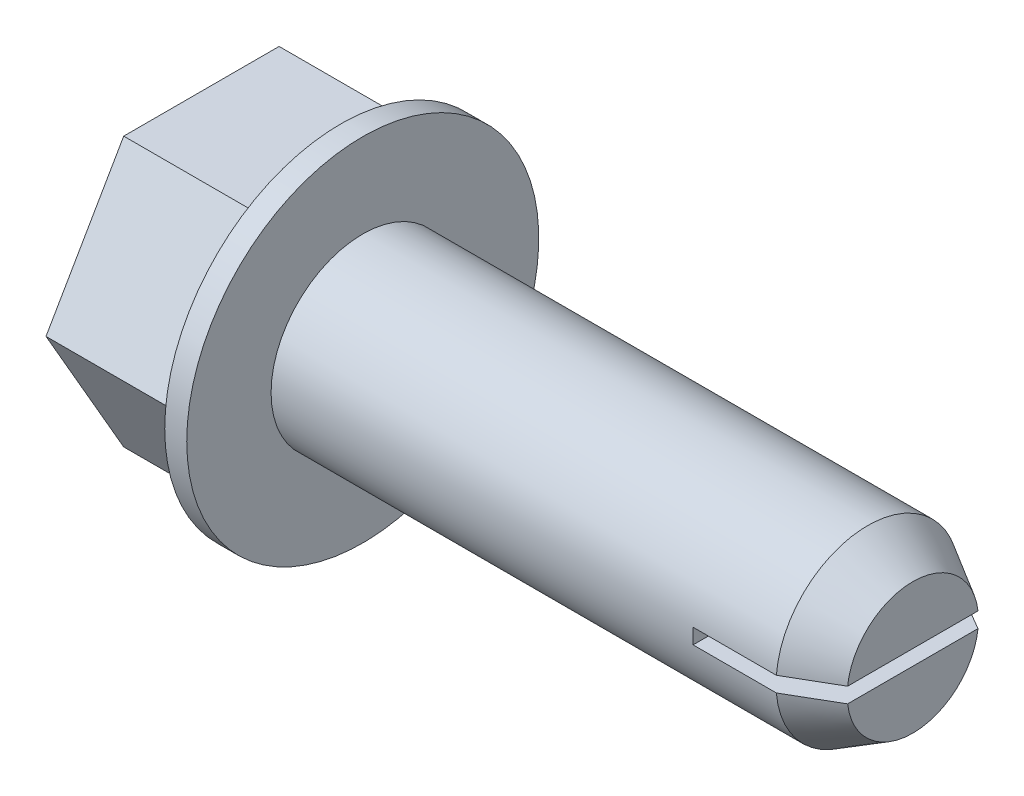
ISO-10303-21;
HEADER;
FILE_DESCRIPTION(('STEP AP214'),'2;1');
FILE_NAME('part.step','',(''),(''),'','','');
FILE_SCHEMA(('AUTOMOTIVE_DESIGN { 1 0 10303 214 1 1 1 1 }'));
ENDSEC;
DATA;
#1=APPLICATION_CONTEXT('core data for automotive mechanical design processes');
#2=APPLICATION_PROTOCOL_DEFINITION('international standard','automotive_design',2000,#1);
#3=PRODUCT_CONTEXT('',#1,'mechanical');
#4=PRODUCT('Part','Part','',(#3));
#5=PRODUCT_RELATED_PRODUCT_CATEGORY('part','',(#4));
#6=PRODUCT_DEFINITION_FORMATION('','',#4);
#7=PRODUCT_DEFINITION_CONTEXT('part definition',#1,'design');
#8=PRODUCT_DEFINITION('design','',#6,#7);
#9=PRODUCT_DEFINITION_SHAPE('','',#8);
#10=(LENGTH_UNIT() NAMED_UNIT(*) SI_UNIT(.MILLI.,.METRE.));
#11=(NAMED_UNIT(*) PLANE_ANGLE_UNIT() SI_UNIT($,.RADIAN.));
#12=(NAMED_UNIT(*) SI_UNIT($,.STERADIAN.) SOLID_ANGLE_UNIT());
#13=UNCERTAINTY_MEASURE_WITH_UNIT(LENGTH_MEASURE(1.E-05),#10,'distance_accuracy_value','');
#14=(GEOMETRIC_REPRESENTATION_CONTEXT(3) GLOBAL_UNCERTAINTY_ASSIGNED_CONTEXT((#13)) GLOBAL_UNIT_ASSIGNED_CONTEXT((#10,
#11,#12)) REPRESENTATION_CONTEXT('',''));
#15=CARTESIAN_POINT('',(0.,0.,0.));
#16=DIRECTION('',(0.,0.,1.));
#17=DIRECTION('',(1.,0.,0.));
#18=AXIS2_PLACEMENT_3D('',#15,#16,#17);
#19=CARTESIAN_POINT('',(17.4882097868151,0.,0.));
#20=DIRECTION('',(-1.,0.,0.));
#21=DIRECTION('',(0.,0.,1.));
#22=AXIS2_PLACEMENT_3D('',#19,#20,#21);
#23=CONICAL_SURFACE('',#22,3.175,0.523598775598292);
#24=CARTESIAN_POINT('',(13.5644644613219,0.264583333333333,-5.43393783266142));
#25=CARTESIAN_POINT('',(14.0871826436278,0.264583333333333,-5.13177479743097));
#26=CARTESIAN_POINT('',(14.6098866976322,0.264583333333333,-4.82958732171453));
#27=CARTESIAN_POINT('',(15.6552095136867,0.264583333333333,-4.22504701620635));
#28=CARTESIAN_POINT('',(16.1778282743568,0.264583333333333,-3.92269418402857));
#29=CARTESIAN_POINT('',(17.2241423772534,0.264583333333333,-3.31700106564912));
#30=CARTESIAN_POINT('',(17.7478373461747,0.264583333333333,-3.01366013407215));
#31=CARTESIAN_POINT('',(18.5330792932285,0.264583333333333,-2.55813812615807));
#32=CARTESIAN_POINT('',(18.794774905413,0.264583333333333,-2.4062132971754));
#33=CARTESIAN_POINT('',(19.3179928265594,0.264583333333333,-2.10206558022107));
#34=CARTESIAN_POINT('',(19.5795151356285,0.264583333333333,-1.94984269243398));
#35=CARTESIAN_POINT('',(19.9713214718428,0.264583333333333,-1.72119162168096));
#36=CARTESIAN_POINT('',(20.1017351693419,0.264583333333333,-1.64498568724022));
#37=CARTESIAN_POINT('',(20.3624339826788,0.264583333333333,-1.49234691242498));
#38=CARTESIAN_POINT('',(20.4927190953951,0.264583333333333,-1.41591406671424));
#39=CARTESIAN_POINT('',(20.7529729191661,0.264583333333333,-1.26275197273211));
#40=CARTESIAN_POINT('',(20.8829418010459,0.264583333333333,-1.18602301477345));
#41=CARTESIAN_POINT('',(21.14251237568,0.264583333333333,-1.03196432965892));
#42=CARTESIAN_POINT('',(21.2721140928904,0.264583333333333,-0.954634643864495));
#43=CARTESIAN_POINT('',(21.4659187118913,0.264583333333333,-0.837750528912931));
#44=CARTESIAN_POINT('',(21.5303977933951,0.264583333333333,-0.798654938496787));
#45=CARTESIAN_POINT('',(21.6590775625645,0.264583333333333,-0.719981892284));
#46=CARTESIAN_POINT('',(21.7232781975706,0.264583333333333,-0.680404350306108));
#47=CARTESIAN_POINT('',(21.8513452286603,0.264583333333333,-0.600412864954114));
#48=CARTESIAN_POINT('',(21.9152106571027,0.264583333333333,-0.559997359060232));
#49=CARTESIAN_POINT('',(22.0103272732384,0.264583333333333,-0.498347656476074));
#50=CARTESIAN_POINT('',(22.0419131277855,0.264583333333333,-0.477630823862634));
#51=CARTESIAN_POINT('',(22.1047544025035,0.264583333333333,-0.435703031053967));
#52=CARTESIAN_POINT('',(22.1360098430145,0.264583333333333,-0.414492101535705));
#53=CARTESIAN_POINT('',(22.1903340018692,0.264583333333333,-0.37667837356804));
#54=CARTESIAN_POINT('',(22.2135134700197,0.264583333333333,-0.360235070512369));
#55=CARTESIAN_POINT('',(22.2594652015796,0.264583333333333,-0.326749250525178));
#56=CARTESIAN_POINT('',(22.2822371615549,0.264583333333333,-0.309706312996171));
#57=CARTESIAN_POINT('',(22.327060694743,0.264583333333333,-0.274797007355579));
#58=CARTESIAN_POINT('',(22.3491137774706,0.264583333333333,-0.256932583966008));
#59=CARTESIAN_POINT('',(22.3920781971358,0.264583333333333,-0.219892857452947));
#60=CARTESIAN_POINT('',(22.4129911568137,0.264583333333333,-0.200719509836215));
#61=CARTESIAN_POINT('',(22.4452340578416,0.264583333333333,-0.167667232199067));
#62=CARTESIAN_POINT('',(22.4572435359932,0.264583333333333,-0.154459018855623));
#63=CARTESIAN_POINT('',(22.479742428192,0.264583333333333,-0.126788829304691));
#64=CARTESIAN_POINT('',(22.4902350299064,0.264583333333333,-0.112329587475477));
#65=CARTESIAN_POINT('',(22.5047631481339,0.264583333333333,-0.0879569053171079));
#66=CARTESIAN_POINT('',(22.5096896477211,0.264583333333333,-0.0785848776158666));
#67=CARTESIAN_POINT('',(22.5181377335612,0.264583333333333,-0.0592246580499537));
#68=CARTESIAN_POINT('',(22.5216621220232,0.264583333333333,-0.0492377417068181));
#69=CARTESIAN_POINT('',(22.526418522633,0.264583333333333,-0.0304037026103416));
#70=CARTESIAN_POINT('',(22.5279260208297,0.264583333333333,-0.0216280028123224));
#71=CARTESIAN_POINT('',(22.5294026767469,0.264583333333333,-0.00394842396421162));
#72=CARTESIAN_POINT('',(22.529372938949,0.264583333333333,0.00495535846215336));
#73=CARTESIAN_POINT('',(22.527783754397,0.264583333333333,0.0226015793310859));
#74=CARTESIAN_POINT('',(22.5262273778035,0.264583333333333,0.0313443057191699));
#75=CARTESIAN_POINT('',(22.521799885777,0.264583333333333,0.0484872271525425));
#76=CARTESIAN_POINT('',(22.5189273250771,0.264583333333333,0.0568870345760276));
#77=CARTESIAN_POINT('',(22.5097392618081,0.264583333333333,0.0791084101084659));
#78=CARTESIAN_POINT('',(22.5024306277301,0.264583333333333,0.0925118789448422));
#79=CARTESIAN_POINT('',(22.4859991306919,0.264583333333333,0.118165386221673));
#80=CARTESIAN_POINT('',(22.4768681425319,0.264583333333333,0.130409883182144));
#81=CARTESIAN_POINT('',(22.4502363411997,0.264583333333333,0.162907775207071));
#82=CARTESIAN_POINT('',(22.4316204301427,0.264583333333333,0.182229711479316));
#83=CARTESIAN_POINT('',(22.3928272705957,0.264583333333333,0.21926143600952));
#84=CARTESIAN_POINT('',(22.3726454888353,0.264583333333333,0.23696619389221));
#85=CARTESIAN_POINT('',(22.331293807366,0.264583333333333,0.271428766852513));
#86=CARTESIAN_POINT('',(22.3101188805033,0.264583333333333,0.288180532250144));
#87=CARTESIAN_POINT('',(22.2672661684661,0.264583333333333,0.320948333636695));
#88=CARTESIAN_POINT('',(22.2455892006051,0.264583333333333,0.336965454114015));
#89=CARTESIAN_POINT('',(22.1807081552448,0.264583333333333,0.383801752180299));
#90=CARTESIAN_POINT('',(22.1370014567618,0.264583333333333,0.413922038870454));
#91=CARTESIAN_POINT('',(22.048896754757,0.264583333333333,0.473137956582079));
#92=CARTESIAN_POINT('',(22.0044985971383,0.264583333333333,0.502233354347341));
#93=CARTESIAN_POINT('',(21.9152410723224,0.264583333333333,0.55980954616495));
#94=CARTESIAN_POINT('',(21.8703812772861,0.264583333333333,0.588289676499199));
#95=CARTESIAN_POINT('',(21.7803932808768,0.264583333333333,0.644823342437673));
#96=CARTESIAN_POINT('',(21.7352650728045,0.264583333333333,0.672876867331631));
#97=CARTESIAN_POINT('',(21.6000529942242,0.264583333333333,0.756326551992342));
#98=CARTESIAN_POINT('',(21.5097027331016,0.264583333333333,0.811290588678406));
#99=CARTESIAN_POINT('',(21.3286744912322,0.264583333333333,0.920566584265846));
#100=CARTESIAN_POINT('',(21.237996704292,0.264583333333333,0.97487886591951));
#101=CARTESIAN_POINT('',(20.9657460397315,0.264583333333333,1.13718911539779));
#102=CARTESIAN_POINT('',(20.7838413218696,0.264583333333333,1.24463004979448));
#103=CARTESIAN_POINT('',(20.4196512860542,0.264583333333333,1.45886639904696));
#104=CARTESIAN_POINT('',(20.2373659641305,0.264583333333333,1.5656618071235));
#105=CARTESIAN_POINT('',(19.872544735206,0.264583333333333,1.77891302602804));
#106=CARTESIAN_POINT('',(19.6900087832199,0.264583333333333,1.88536875994202));
#107=CARTESIAN_POINT('',(19.3248125987412,0.264583333333333,2.09806484028111));
#108=CARTESIAN_POINT('',(19.1421523667771,0.264583333333333,2.20430518761478));
#109=CARTESIAN_POINT('',(18.593482033195,0.264583333333333,2.52315422708799));
#110=CARTESIAN_POINT('',(18.2273529450556,0.264583333333333,2.73555815607347));
#111=CARTESIAN_POINT('',(17.4949677931199,0.264583333333333,3.1600954634988));
#112=CARTESIAN_POINT('',(17.1287117383933,0.264583333333333,3.37222885759761));
#113=CARTESIAN_POINT('',(16.4958030337913,0.264583333333333,3.73863282252731));
#114=CARTESIAN_POINT('',(16.2291708103373,0.264583333333333,3.89293867410942));
#115=CARTESIAN_POINT('',(15.6958693731254,0.264583333333333,4.20149757635999));
#116=CARTESIAN_POINT('',(15.4292001587852,0.264583333333333,4.35575062602182));
#117=CARTESIAN_POINT('',(14.896193932015,0.264583333333333,4.66401108570785));
#118=CARTESIAN_POINT('',(14.6298569504703,0.264583333333333,4.81801854913642));
#119=CARTESIAN_POINT('',(14.0971701645499,0.264583333333333,5.12600013471121));
#120=CARTESIAN_POINT('',(13.8308203604949,0.264583333333333,5.27997425741216));
#121=CARTESIAN_POINT('',(13.5644644613219,0.264583333333333,5.43393783266142));
#122=B_SPLINE_CURVE_WITH_KNOTS('',3,(#24,#25,#26,#27,#28,#29,#30,#31,#32,#33,#34,#35,#36,#37,
#38,#39,#40,#41,#42,#43,#44,#45,#46,#47,#48,#49,#50,#51,#52,#53,#54,#55,#56,#57,#58,#59,#60,#61,
#62,#63,#64,#65,#66,#67,#68,#69,#70,#71,#72,#73,#74,#75,#76,#77,#78,#79,#80,#81,#82,#83,#84,#85,
#86,#87,#88,#89,#90,#91,#92,#93,#94,#95,#96,#97,#98,#99,#100,#101,#102,#103,#104,#105,#106,#107,
#108,#109,#110,#111,#112,#113,#114,#115,#116,#117,#118,#119,#120,#121),.UNSPECIFIED.,.F.,.F.,(4,
2,2,2,2,2,2,2,2,2,2,2,2,2,2,2,2,2,2,2,2,2,2,2,2,2,2,2,2,2,2,2,2,2,2,2,2,2,2,2,2,2,2,2,2,2,2,2,
4),(0.,1.81130646860229,3.622639802236,5.43825212692843,6.34604704982731,7.25384141078979,
7.7069811118876,8.16013155518211,8.61291486136263,9.06566726394993,9.29188280622949,
9.51813941174702,9.74486462234725,9.85818301623115,9.97149439317706,10.0567476343856,
10.1420619154501,10.2271836969868,10.3121809794991,10.3656832581214,10.4190714160232,
10.4507572634153,10.4823794625921,10.5089710788502,10.5355435896841,10.5620627709669,
10.5886111423075,10.6341434787856,10.6798835544699,10.760150872277,10.8406599224638,
10.9216332565146,11.0024829336184,11.1616890535531,11.3209311763972,11.480337273529,
11.6397473660916,11.9570077621073,12.2741039642763,12.9078943665277,13.5416914132333,
14.1756230218318,14.8095519507311,16.0793915609185,17.3491539924864,18.2733440817586,
19.197550905017,20.120526080354,21.0434844930674),.UNSPECIFIED.);
#123=CARTESIAN_POINT('',(17.4882097868151,0.264583333333333,-3.16395648827891));
#124=VERTEX_POINT('',#123);
#125=CARTESIAN_POINT('',(19.05,0.264583333333333,-2.25785042678257));
#126=VERTEX_POINT('',#125);
#127=EDGE_CURVE('E537',#124,#126,#122,.T.);
#128=ORIENTED_EDGE('',*,*,#127,.F.);
#129=CARTESIAN_POINT('',(17.4882097868151,0.,0.));
#130=DIRECTION('',(-1.,0.,0.));
#131=DIRECTION('',(0.,0.,1.));
#132=AXIS2_PLACEMENT_3D('',#129,#130,#131);
#133=CIRCLE('',#132,3.175);
#134=CARTESIAN_POINT('',(17.4882097868151,0.264583333333333,3.16395648827891));
#135=VERTEX_POINT('',#134);
#136=EDGE_CURVE('E216',#135,#124,#133,.T.);
#137=ORIENTED_EDGE('',*,*,#136,.F.);
#138=CARTESIAN_POINT('',(19.05,0.264583333333333,2.25785042678256));
#139=VERTEX_POINT('',#138);
#140=EDGE_CURVE('E540',#139,#135,#122,.T.);
#141=ORIENTED_EDGE('',*,*,#140,.F.);
#142=CARTESIAN_POINT('',(19.05,0.,0.));
#143=DIRECTION('',(-1.,0.,0.));
#144=DIRECTION('',(0.,0.,1.));
#145=AXIS2_PLACEMENT_3D('',#142,#143,#144);
#146=CIRCLE('',#145,2.2733);
#147=EDGE_CURVE('E215',#139,#126,#146,.T.);
#148=ORIENTED_EDGE('',*,*,#147,.T.);
#149=EDGE_LOOP('',(#128,#137,#141,#148));
#150=FACE_BOUND('',#149,.T.);
#151=ADVANCED_FACE('F106',(#150),#23,.T.);
#152=CARTESIAN_POINT('',(19.05,3.175,0.));
#153=DIRECTION('',(-1.,0.,0.));
#154=DIRECTION('',(0.,0.,1.));
#155=AXIS2_PLACEMENT_3D('',#152,#153,#154);
#156=PLANE('',#155);
#157=ORIENTED_EDGE('',*,*,#147,.F.);
#158=DIRECTION('',(0.,0.,-1.));
#159=VECTOR('',#158,1.);
#160=CARTESIAN_POINT('',(19.05,0.264583333333333,0.));
#161=LINE('',#160,#159);
#162=EDGE_CURVE('E202',#139,#126,#161,.T.);
#163=ORIENTED_EDGE('',*,*,#162,.T.);
#164=EDGE_LOOP('',(#157,#163));
#165=FACE_BOUND('',#164,.T.);
#166=ADVANCED_FACE('F326',(#165),#156,.F.);
#167=CARTESIAN_POINT('',(0.,0.,0.));
#168=DIRECTION('',(-1.,0.,0.));
#169=DIRECTION('',(0.,0.,1.));
#170=AXIS2_PLACEMENT_3D('',#167,#168,#169);
#171=CYLINDRICAL_SURFACE('',#170,3.175);
#172=CARTESIAN_POINT('',(0.,0.,0.));
#173=DIRECTION('',(-1.,0.,0.));
#174=DIRECTION('',(0.,0.,1.));
#175=AXIS2_PLACEMENT_3D('',#172,#173,#174);
#176=CIRCLE('',#175,3.175);
#177=CARTESIAN_POINT('',(0.,0.,3.175));
#178=VERTEX_POINT('',#177);
#179=EDGE_CURVE('E203',#178,#178,#176,.T.);
#180=ORIENTED_EDGE('',*,*,#179,.F.);
#181=EDGE_LOOP('',(#180));
#182=FACE_BOUND('',#181,.T.);
#183=CARTESIAN_POINT('',(14.605,0.,0.));
#184=DIRECTION('',(-1.,0.,0.));
#185=DIRECTION('',(0.,0.,1.));
#186=AXIS2_PLACEMENT_3D('',#183,#184,#185);
#187=CIRCLE('',#186,3.175);
#188=CARTESIAN_POINT('',(14.605,-0.264583333333333,3.16395648827891));
#189=VERTEX_POINT('',#188);
#190=CARTESIAN_POINT('',(14.605,0.264583333333333,3.16395648827891));
#191=VERTEX_POINT('',#190);
#192=EDGE_CURVE('E80',#189,#191,#187,.T.);
#193=ORIENTED_EDGE('',*,*,#192,.T.);
#194=DIRECTION('',(-1.,0.,0.));
#195=VECTOR('',#194,1.);
#196=CARTESIAN_POINT('',(0.,0.264583333333333,3.16395648827891));
#197=LINE('',#196,#195);
#198=EDGE_CURVE('E303',#191,#135,#197,.F.);
#199=ORIENTED_EDGE('',*,*,#198,.T.);
#200=ORIENTED_EDGE('',*,*,#136,.T.);
#201=DIRECTION('',(-1.,0.,0.));
#202=VECTOR('',#201,1.);
#203=CARTESIAN_POINT('',(0.,0.264583333333333,-3.16395648827891));
#204=LINE('',#203,#202);
#205=CARTESIAN_POINT('',(14.605,0.264583333333333,-3.16395648827891));
#206=VERTEX_POINT('',#205);
#207=EDGE_CURVE('E291',#124,#206,#204,.T.);
#208=ORIENTED_EDGE('',*,*,#207,.T.);
#209=CARTESIAN_POINT('',(14.605,-0.264583333333333,-3.16395648827891));
#210=VERTEX_POINT('',#209);
#211=EDGE_CURVE('E110',#206,#210,#187,.T.);
#212=ORIENTED_EDGE('',*,*,#211,.T.);
#213=DIRECTION('',(-1.,0.,0.));
#214=VECTOR('',#213,1.);
#215=CARTESIAN_POINT('',(0.,-0.264583333333333,-3.16395648827891));
#216=LINE('',#215,#214);
#217=CARTESIAN_POINT('',(17.4882097868151,-0.264583333333333,-3.16395648827891));
#218=VERTEX_POINT('',#217);
#219=EDGE_CURVE('E211',#210,#218,#216,.F.);
#220=ORIENTED_EDGE('',*,*,#219,.T.);
#221=CARTESIAN_POINT('',(17.4882097868151,-0.264583333333333,3.16395648827891));
#222=VERTEX_POINT('',#221);
#223=EDGE_CURVE('E210',#218,#222,#133,.T.);
#224=ORIENTED_EDGE('',*,*,#223,.T.);
#225=DIRECTION('',(-1.,0.,0.));
#226=VECTOR('',#225,1.);
#227=CARTESIAN_POINT('',(0.,-0.264583333333333,3.16395648827891));
#228=LINE('',#227,#226);
#229=EDGE_CURVE('E543',#222,#189,#228,.T.);
#230=ORIENTED_EDGE('',*,*,#229,.T.);
#231=EDGE_LOOP('',(#193,#199,#200,#208,#212,#220,#224,#230));
#232=FACE_BOUND('',#231,.T.);
#233=ADVANCED_FACE('F290',(#182,#232),#171,.T.);
#234=CARTESIAN_POINT('',(-4.6228,3.72872,0.));
#235=DIRECTION('',(1.,0.,0.));
#236=DIRECTION('',(0.,0.,-1.));
#237=AXIS2_PLACEMENT_3D('',#234,#235,#236);
#238=PLANE('',#237);
#239=CARTESIAN_POINT('',(-4.6228,0.,0.));
#240=DIRECTION('',(-1.,0.,0.));
#241=DIRECTION('',(0.,0.,1.));
#242=AXIS2_PLACEMENT_3D('',#239,#240,#241);
#243=CIRCLE('',#242,3.72872);
#244=CARTESIAN_POINT('',(-4.6228,0.,3.72872));
#245=VERTEX_POINT('',#244);
#246=EDGE_CURVE('E270',#245,#245,#243,.T.);
#247=ORIENTED_EDGE('',*,*,#246,.T.);
#248=EDGE_LOOP('',(#247));
#249=FACE_BOUND('',#248,.T.);
#250=ADVANCED_FACE('F108',(#249),#238,.F.);
#251=CARTESIAN_POINT('',(0.,3.175,0.));
#252=DIRECTION('',(-1.,0.,0.));
#253=DIRECTION('',(0.,0.,1.));
#254=AXIS2_PLACEMENT_3D('',#251,#252,#253);
#255=PLANE('',#254);
#256=CARTESIAN_POINT('',(0.,0.,0.));
#257=DIRECTION('',(-1.,0.,0.));
#258=DIRECTION('',(0.,0.,1.));
#259=AXIS2_PLACEMENT_3D('',#256,#257,#258);
#260=CIRCLE('',#259,6.096);
#261=CARTESIAN_POINT('',(0.,0.,6.096));
#262=VERTEX_POINT('',#261);
#263=EDGE_CURVE('E280',#262,#262,#260,.T.);
#264=ORIENTED_EDGE('',*,*,#263,.F.);
#265=EDGE_LOOP('',(#264));
#266=FACE_BOUND('',#265,.T.);
#267=ORIENTED_EDGE('',*,*,#179,.T.);
#268=EDGE_LOOP('',(#267));
#269=FACE_BOUND('',#268,.T.);
#270=ADVANCED_FACE('F376',(#266,#269),#255,.F.);
#271=CARTESIAN_POINT('',(0.,0.,0.));
#272=DIRECTION('',(-1.,0.,0.));
#273=DIRECTION('',(0.,0.,1.));
#274=AXIS2_PLACEMENT_3D('',#271,#272,#273);
#275=CYLINDRICAL_SURFACE('',#274,6.096);
#276=CARTESIAN_POINT('',(-0.762,0.,0.));
#277=DIRECTION('',(-1.,0.,0.));
#278=DIRECTION('',(0.,0.,1.));
#279=AXIS2_PLACEMENT_3D('',#276,#277,#278);
#280=CIRCLE('',#279,6.096);
#281=CARTESIAN_POINT('',(-0.762,0.,6.096));
#282=VERTEX_POINT('',#281);
#283=EDGE_CURVE('E277',#282,#282,#280,.T.);
#284=ORIENTED_EDGE('',*,*,#283,.F.);
#285=EDGE_LOOP('',(#284));
#286=FACE_BOUND('',#285,.T.);
#287=ORIENTED_EDGE('',*,*,#263,.T.);
#288=EDGE_LOOP('',(#287));
#289=FACE_BOUND('',#288,.T.);
#290=ADVANCED_FACE('F372',(#286,#289),#275,.T.);
#291=CARTESIAN_POINT('',(-0.762,6.096,0.));
#292=DIRECTION('',(1.,0.,0.));
#293=DIRECTION('',(0.,0.,-1.));
#294=AXIS2_PLACEMENT_3D('',#291,#292,#293);
#295=PLANE('',#294);
#296=DIRECTION('',(0.,0.,1.));
#297=VECTOR('',#296,1.);
#298=CARTESIAN_POINT('',(-0.762000000008811,-4.6609,0.));
#299=LINE('',#298,#297);
#300=CARTESIAN_POINT('',(-0.762,-4.6609,-2.69097186966593));
#301=VERTEX_POINT('',#300);
#302=CARTESIAN_POINT('',(-0.762,-4.6609,2.69097186966593));
#303=VERTEX_POINT('',#302);
#304=EDGE_CURVE('E225',#301,#303,#299,.T.);
#305=ORIENTED_EDGE('',*,*,#304,.F.);
#306=DIRECTION('',(0.,-0.866025403784439,0.5));
#307=VECTOR('',#306,1.);
#308=CARTESIAN_POINT('',(-0.762000000008811,-10.7431892055105,0.820639440424721));
#309=LINE('',#308,#307);
#310=CARTESIAN_POINT('',(-0.761999999895124,0.,-5.38194373933185));
#311=VERTEX_POINT('',#310);
#312=EDGE_CURVE('E129',#311,#301,#309,.T.);
#313=ORIENTED_EDGE('',*,*,#312,.F.);
#314=DIRECTION('',(0.,-0.866025403784439,-0.5));
#315=VECTOR('',#314,1.);
#316=CARTESIAN_POINT('',(-0.762000000008811,-6.08228920551051,-8.8935550494225));
#317=LINE('',#316,#315);
#318=CARTESIAN_POINT('',(-0.762,4.6609,-2.69097186966593));
#319=VERTEX_POINT('',#318);
#320=EDGE_CURVE('E259',#319,#311,#317,.T.);
#321=ORIENTED_EDGE('',*,*,#320,.F.);
#322=DIRECTION('',(0.,0.,-1.));
#323=VECTOR('',#322,1.);
#324=CARTESIAN_POINT('',(-0.762000000008811,4.6609,0.));
#325=LINE('',#324,#323);
#326=CARTESIAN_POINT('',(-0.762,4.6609,2.69097186966593));
#327=VERTEX_POINT('',#326);
#328=EDGE_CURVE('E250',#327,#319,#325,.T.);
#329=ORIENTED_EDGE('',*,*,#328,.F.);
#330=DIRECTION('',(0.,0.866025403784439,-0.5));
#331=VECTOR('',#330,1.);
#332=CARTESIAN_POINT('',(-0.762000000008811,-6.08228920551051,8.8935550494225));
#333=LINE('',#332,#331);
#334=CARTESIAN_POINT('',(-0.762,0.,5.38194373933185));
#335=VERTEX_POINT('',#334);
#336=EDGE_CURVE('E241',#335,#327,#333,.T.);
#337=ORIENTED_EDGE('',*,*,#336,.F.);
#338=DIRECTION('',(0.,0.866025403784439,0.5));
#339=VECTOR('',#338,1.);
#340=CARTESIAN_POINT('',(-0.762000000008811,-10.7431892055105,-0.820639440424718));
#341=LINE('',#340,#339);
#342=EDGE_CURVE('E232',#303,#335,#341,.T.);
#343=ORIENTED_EDGE('',*,*,#342,.F.);
#344=EDGE_LOOP('',(#305,#313,#321,#329,#337,#343));
#345=FACE_BOUND('',#344,.T.);
#346=ORIENTED_EDGE('',*,*,#283,.T.);
#347=EDGE_LOOP('',(#346));
#348=FACE_BOUND('',#347,.T.);
#349=ADVANCED_FACE('F368',(#345,#348),#295,.F.);
#350=CARTESIAN_POINT('',(-5.588,4.6609,0.));
#351=DIRECTION('',(1.,0.,0.));
#352=DIRECTION('',(0.,0.,-1.));
#353=AXIS2_PLACEMENT_3D('',#350,#351,#352);
#354=PLANE('',#353);
#355=CARTESIAN_POINT('',(-5.588,0.,0.));
#356=DIRECTION('',(-1.,0.,0.));
#357=DIRECTION('',(0.,0.,1.));
#358=AXIS2_PLACEMENT_3D('',#355,#356,#357);
#359=CIRCLE('',#358,3.72872);
#360=CARTESIAN_POINT('',(-5.588,0.,3.72872));
#361=VERTEX_POINT('',#360);
#362=EDGE_CURVE('E274',#361,#361,#359,.T.);
#363=ORIENTED_EDGE('',*,*,#362,.F.);
#364=EDGE_LOOP('',(#363));
#365=FACE_BOUND('',#364,.T.);
#366=DIRECTION('',(0.,-0.866025403784439,0.5));
#367=VECTOR('',#366,1.);
#368=CARTESIAN_POINT('',(-5.588,-10.7431892055105,0.820639440424721));
#369=LINE('',#368,#367);
#370=CARTESIAN_POINT('',(-5.588,0.,-5.38194373933185));
#371=VERTEX_POINT('',#370);
#372=CARTESIAN_POINT('',(-5.588,-4.6609,-2.69097186966593));
#373=VERTEX_POINT('',#372);
#374=EDGE_CURVE('E265',#371,#373,#369,.T.);
#375=ORIENTED_EDGE('',*,*,#374,.T.);
#376=DIRECTION('',(0.,0.,1.));
#377=VECTOR('',#376,1.);
#378=CARTESIAN_POINT('',(-5.588,-4.6609,0.));
#379=LINE('',#378,#377);
#380=CARTESIAN_POINT('',(-5.588,-4.6609,2.69097186966593));
#381=VERTEX_POINT('',#380);
#382=EDGE_CURVE('E229',#373,#381,#379,.T.);
#383=ORIENTED_EDGE('',*,*,#382,.T.);
#384=DIRECTION('',(0.,0.866025403784439,0.5));
#385=VECTOR('',#384,1.);
#386=CARTESIAN_POINT('',(-5.588,-10.7431892055105,-0.820639440424718));
#387=LINE('',#386,#385);
#388=CARTESIAN_POINT('',(-5.588,0.,5.38194373933185));
#389=VERTEX_POINT('',#388);
#390=EDGE_CURVE('E238',#381,#389,#387,.T.);
#391=ORIENTED_EDGE('',*,*,#390,.T.);
#392=DIRECTION('',(0.,0.866025403784439,-0.5));
#393=VECTOR('',#392,1.);
#394=CARTESIAN_POINT('',(-5.588,-6.08228920551051,8.8935550494225));
#395=LINE('',#394,#393);
#396=CARTESIAN_POINT('',(-5.588,4.6609,2.69097186966592));
#397=VERTEX_POINT('',#396);
#398=EDGE_CURVE('E247',#389,#397,#395,.T.);
#399=ORIENTED_EDGE('',*,*,#398,.T.);
#400=DIRECTION('',(0.,0.,-1.));
#401=VECTOR('',#400,1.);
#402=CARTESIAN_POINT('',(-5.588,4.6609,0.));
#403=LINE('',#402,#401);
#404=CARTESIAN_POINT('',(-5.588,4.6609,-2.69097186966593));
#405=VERTEX_POINT('',#404);
#406=EDGE_CURVE('E256',#397,#405,#403,.T.);
#407=ORIENTED_EDGE('',*,*,#406,.T.);
#408=DIRECTION('',(0.,-0.866025403784439,-0.5));
#409=VECTOR('',#408,1.);
#410=CARTESIAN_POINT('',(-5.588,-6.08228920551051,-8.8935550494225));
#411=LINE('',#410,#409);
#412=EDGE_CURVE('E267',#405,#371,#411,.T.);
#413=ORIENTED_EDGE('',*,*,#412,.T.);
#414=EDGE_LOOP('',(#375,#383,#391,#399,#407,#413));
#415=FACE_BOUND('',#414,.T.);
#416=ADVANCED_FACE('F364',(#365,#415),#354,.F.);
#417=CARTESIAN_POINT('',(0.,0.,0.));
#418=DIRECTION('',(-1.,0.,0.));
#419=DIRECTION('',(0.,0.,1.));
#420=AXIS2_PLACEMENT_3D('',#417,#418,#419);
#421=CYLINDRICAL_SURFACE('',#420,3.72872);
#422=ORIENTED_EDGE('',*,*,#246,.F.);
#423=EDGE_LOOP('',(#422));
#424=FACE_BOUND('',#423,.T.);
#425=ORIENTED_EDGE('',*,*,#362,.T.);
#426=EDGE_LOOP('',(#425));
#427=FACE_BOUND('',#426,.T.);
#428=ADVANCED_FACE('F358',(#424,#427),#421,.F.);
#429=CARTESIAN_POINT('',(500000.,-10.7431892055105,0.820639440424721));
#430=DIRECTION('',(0.,-0.5,-0.866025403784439));
#431=DIRECTION('',(0.,0.866025403784439,-0.5));
#432=AXIS2_PLACEMENT_3D('',#429,#430,#431);
#433=PLANE('',#432);
#434=DIRECTION('',(-1.,0.,0.));
#435=VECTOR('',#434,1.);
#436=CARTESIAN_POINT('',(500000.,0.,-5.38194373933185));
#437=LINE('',#436,#435);
#438=EDGE_CURVE('E264',#311,#371,#437,.T.);
#439=ORIENTED_EDGE('',*,*,#438,.F.);
#440=ORIENTED_EDGE('',*,*,#312,.T.);
#441=DIRECTION('',(-1.,0.,0.));
#442=VECTOR('',#441,1.);
#443=CARTESIAN_POINT('',(500000.,-4.6609,-2.69097186966593));
#444=LINE('',#443,#442);
#445=EDGE_CURVE('E219',#301,#373,#444,.T.);
#446=ORIENTED_EDGE('',*,*,#445,.T.);
#447=ORIENTED_EDGE('',*,*,#374,.F.);
#448=EDGE_LOOP('',(#439,#440,#446,#447));
#449=FACE_BOUND('',#448,.T.);
#450=ADVANCED_FACE('F355',(#449),#433,.T.);
#451=CARTESIAN_POINT('',(500000.,-6.08228920551051,-8.8935550494225));
#452=DIRECTION('',(0.,0.5,-0.866025403784439));
#453=DIRECTION('',(0.,0.866025403784439,0.5));
#454=AXIS2_PLACEMENT_3D('',#451,#452,#453);
#455=PLANE('',#454);
#456=ORIENTED_EDGE('',*,*,#412,.F.);
#457=DIRECTION('',(-1.,0.,0.));
#458=VECTOR('',#457,1.);
#459=CARTESIAN_POINT('',(500000.,4.6609,-2.69097186966593));
#460=LINE('',#459,#458);
#461=EDGE_CURVE('E253',#319,#405,#460,.T.);
#462=ORIENTED_EDGE('',*,*,#461,.F.);
#463=ORIENTED_EDGE('',*,*,#320,.T.);
#464=ORIENTED_EDGE('',*,*,#438,.T.);
#465=EDGE_LOOP('',(#456,#462,#463,#464));
#466=FACE_BOUND('',#465,.T.);
#467=ADVANCED_FACE('F353',(#466),#455,.T.);
#468=CARTESIAN_POINT('',(500000.,4.6609,0.));
#469=DIRECTION('',(0.,1.,0.));
#470=DIRECTION('',(0.,0.,1.));
#471=AXIS2_PLACEMENT_3D('',#468,#469,#470);
#472=PLANE('',#471);
#473=ORIENTED_EDGE('',*,*,#406,.F.);
#474=DIRECTION('',(-1.,0.,0.));
#475=VECTOR('',#474,1.);
#476=CARTESIAN_POINT('',(500000.,4.6609,2.69097186966592));
#477=LINE('',#476,#475);
#478=EDGE_CURVE('E244',#327,#397,#477,.T.);
#479=ORIENTED_EDGE('',*,*,#478,.F.);
#480=ORIENTED_EDGE('',*,*,#328,.T.);
#481=ORIENTED_EDGE('',*,*,#461,.T.);
#482=EDGE_LOOP('',(#473,#479,#480,#481));
#483=FACE_BOUND('',#482,.T.);
#484=ADVANCED_FACE('F349',(#483),#472,.T.);
#485=CARTESIAN_POINT('',(500000.,-6.08228920551051,8.8935550494225));
#486=DIRECTION('',(0.,0.5,0.866025403784439));
#487=DIRECTION('',(0.,-0.866025403784439,0.5));
#488=AXIS2_PLACEMENT_3D('',#485,#486,#487);
#489=PLANE('',#488);
#490=ORIENTED_EDGE('',*,*,#398,.F.);
#491=DIRECTION('',(-1.,0.,0.));
#492=VECTOR('',#491,1.);
#493=CARTESIAN_POINT('',(500000.,0.,5.38194373933185));
#494=LINE('',#493,#492);
#495=EDGE_CURVE('E235',#335,#389,#494,.T.);
#496=ORIENTED_EDGE('',*,*,#495,.F.);
#497=ORIENTED_EDGE('',*,*,#336,.T.);
#498=ORIENTED_EDGE('',*,*,#478,.T.);
#499=EDGE_LOOP('',(#490,#496,#497,#498));
#500=FACE_BOUND('',#499,.T.);
#501=ADVANCED_FACE('F342',(#500),#489,.T.);
#502=CARTESIAN_POINT('',(500000.,-10.7431892055105,-0.820639440424718));
#503=DIRECTION('',(0.,-0.5,0.866025403784439));
#504=DIRECTION('',(0.,-0.866025403784439,-0.5));
#505=AXIS2_PLACEMENT_3D('',#502,#503,#504);
#506=PLANE('',#505);
#507=ORIENTED_EDGE('',*,*,#390,.F.);
#508=DIRECTION('',(-1.,0.,0.));
#509=VECTOR('',#508,1.);
#510=CARTESIAN_POINT('',(500000.,-4.6609,2.69097186966593));
#511=LINE('',#510,#509);
#512=EDGE_CURVE('E226',#303,#381,#511,.T.);
#513=ORIENTED_EDGE('',*,*,#512,.F.);
#514=ORIENTED_EDGE('',*,*,#342,.T.);
#515=ORIENTED_EDGE('',*,*,#495,.T.);
#516=EDGE_LOOP('',(#507,#513,#514,#515));
#517=FACE_BOUND('',#516,.T.);
#518=ADVANCED_FACE('F337',(#517),#506,.T.);
#519=CARTESIAN_POINT('',(500000.,-4.6609,0.));
#520=DIRECTION('',(0.,-1.,0.));
#521=DIRECTION('',(0.,0.,-1.));
#522=AXIS2_PLACEMENT_3D('',#519,#520,#521);
#523=PLANE('',#522);
#524=ORIENTED_EDGE('',*,*,#382,.F.);
#525=ORIENTED_EDGE('',*,*,#445,.F.);
#526=ORIENTED_EDGE('',*,*,#304,.T.);
#527=ORIENTED_EDGE('',*,*,#512,.T.);
#528=EDGE_LOOP('',(#524,#525,#526,#527));
#529=FACE_BOUND('',#528,.T.);
#530=ADVANCED_FACE('F333',(#529),#523,.T.);
#531=CARTESIAN_POINT('',(13.5644644613219,-0.264583333333333,5.43393783266142));
#532=CARTESIAN_POINT('',(14.0871826436278,-0.264583333333333,5.13177479743097));
#533=CARTESIAN_POINT('',(14.6098866976322,-0.264583333333333,4.82958732171453));
#534=CARTESIAN_POINT('',(15.6552095136867,-0.264583333333333,4.22504701620634));
#535=CARTESIAN_POINT('',(16.1778282743568,-0.264583333333333,3.92269418402857));
#536=CARTESIAN_POINT('',(17.2241423772534,-0.264583333333333,3.31700106564912));
#537=CARTESIAN_POINT('',(17.7478373461747,-0.264583333333333,3.01366013407215));
#538=CARTESIAN_POINT('',(18.5330792932285,-0.264583333333333,2.55813812615807));
#539=CARTESIAN_POINT('',(18.794774905413,-0.264583333333333,2.4062132971754));
#540=CARTESIAN_POINT('',(19.3179928265594,-0.264583333333333,2.10206558022107));
#541=CARTESIAN_POINT('',(19.5795151356285,-0.264583333333333,1.94984269243398));
#542=CARTESIAN_POINT('',(19.9713214718428,-0.264583333333333,1.72119162168097));
#543=CARTESIAN_POINT('',(20.1017351693419,-0.264583333333333,1.64498568724022));
#544=CARTESIAN_POINT('',(20.3624339826788,-0.264583333333333,1.49234691242498));
#545=CARTESIAN_POINT('',(20.4927190953951,-0.264583333333333,1.41591406671424));
#546=CARTESIAN_POINT('',(20.7529729191661,-0.264583333333333,1.26275197273211));
#547=CARTESIAN_POINT('',(20.8829418010459,-0.264583333333333,1.18602301477345));
#548=CARTESIAN_POINT('',(21.14251237568,-0.264583333333333,1.03196432965892));
#549=CARTESIAN_POINT('',(21.2721140928904,-0.264583333333333,0.954634643864495));
#550=CARTESIAN_POINT('',(21.4659187118913,-0.264583333333333,0.837750528912931));
#551=CARTESIAN_POINT('',(21.5303977933951,-0.264583333333333,0.798654938496787));
#552=CARTESIAN_POINT('',(21.6590775625645,-0.264583333333333,0.719981892283998));
#553=CARTESIAN_POINT('',(21.7232781975706,-0.264583333333333,0.680404350306105));
#554=CARTESIAN_POINT('',(21.8513452286603,-0.264583333333333,0.60041286495411));
#555=CARTESIAN_POINT('',(21.9152106571027,-0.264583333333333,0.55999735906023));
#556=CARTESIAN_POINT('',(22.0103272732384,-0.264583333333333,0.498347656476073));
#557=CARTESIAN_POINT('',(22.0419131277855,-0.264583333333333,0.477630823862632));
#558=CARTESIAN_POINT('',(22.1047544025035,-0.264583333333333,0.435703031053967));
#559=CARTESIAN_POINT('',(22.1360098430145,-0.264583333333333,0.414492101535704));
#560=CARTESIAN_POINT('',(22.1903340018692,-0.264583333333333,0.37667837356804));
#561=CARTESIAN_POINT('',(22.2135134700197,-0.264583333333333,0.360235070512369));
#562=CARTESIAN_POINT('',(22.2594652015796,-0.264583333333333,0.326749250525178));
#563=CARTESIAN_POINT('',(22.2822371615549,-0.264583333333333,0.30970631299617));
#564=CARTESIAN_POINT('',(22.327060694743,-0.264583333333333,0.274797007355579));
#565=CARTESIAN_POINT('',(22.3491137774706,-0.264583333333333,0.256932583966008));
#566=CARTESIAN_POINT('',(22.3920781971358,-0.264583333333333,0.219892857452947));
#567=CARTESIAN_POINT('',(22.4129911568137,-0.264583333333333,0.200719509836214));
#568=CARTESIAN_POINT('',(22.4452340578416,-0.264583333333333,0.167667232199067));
#569=CARTESIAN_POINT('',(22.4572435359932,-0.264583333333333,0.154459018855623));
#570=CARTESIAN_POINT('',(22.479742428192,-0.264583333333333,0.126788829304691));
#571=CARTESIAN_POINT('',(22.4902350299064,-0.264583333333333,0.112329587475477));
#572=CARTESIAN_POINT('',(22.5047631481339,-0.264583333333333,0.0879569053171077));
#573=CARTESIAN_POINT('',(22.5096896477211,-0.264583333333333,0.0785848776158665));
#574=CARTESIAN_POINT('',(22.5181377335612,-0.264583333333333,0.0592246580499535));
#575=CARTESIAN_POINT('',(22.5216621220232,-0.264583333333333,0.0492377417068179));
#576=CARTESIAN_POINT('',(22.526418522633,-0.264583333333333,0.0304037026103415));
#577=CARTESIAN_POINT('',(22.5279260208297,-0.264583333333333,0.0216280028123223));
#578=CARTESIAN_POINT('',(22.5294026767469,-0.264583333333333,0.0039484239642115));
#579=CARTESIAN_POINT('',(22.529372938949,-0.264583333333333,-0.00495535846215348));
#580=CARTESIAN_POINT('',(22.527783754397,-0.264583333333333,-0.022601579331086));
#581=CARTESIAN_POINT('',(22.5262273778035,-0.264583333333333,-0.03134430571917));
#582=CARTESIAN_POINT('',(22.521799885777,-0.264583333333333,-0.0484872271525425));
#583=CARTESIAN_POINT('',(22.5189273250771,-0.264583333333333,-0.0568870345760277));
#584=CARTESIAN_POINT('',(22.5097392618081,-0.264583333333333,-0.0791084101084659));
#585=CARTESIAN_POINT('',(22.5024306277301,-0.264583333333333,-0.0925118789448423));
#586=CARTESIAN_POINT('',(22.4859991306919,-0.264583333333333,-0.118165386221673));
#587=CARTESIAN_POINT('',(22.4768681425319,-0.264583333333333,-0.130409883182144));
#588=CARTESIAN_POINT('',(22.4502363411997,-0.264583333333333,-0.162907775207072));
#589=CARTESIAN_POINT('',(22.4316204301427,-0.264583333333333,-0.182229711479319));
#590=CARTESIAN_POINT('',(22.3928272705957,-0.264583333333333,-0.219261436009522));
#591=CARTESIAN_POINT('',(22.3726454888353,-0.264583333333333,-0.236966193892211));
#592=CARTESIAN_POINT('',(22.331293807366,-0.264583333333333,-0.271428766852512));
#593=CARTESIAN_POINT('',(22.3101188805033,-0.264583333333333,-0.288180532250143));
#594=CARTESIAN_POINT('',(22.2672661684661,-0.264583333333333,-0.320948333636694));
#595=CARTESIAN_POINT('',(22.2455892006051,-0.264583333333333,-0.336965454114015));
#596=CARTESIAN_POINT('',(22.1807081552448,-0.264583333333333,-0.383801752180299));
#597=CARTESIAN_POINT('',(22.1370014567618,-0.264583333333333,-0.413922038870453));
#598=CARTESIAN_POINT('',(22.048896754757,-0.264583333333333,-0.473137956582078));
#599=CARTESIAN_POINT('',(22.0044985971383,-0.264583333333333,-0.50223335434734));
#600=CARTESIAN_POINT('',(21.9152410723224,-0.264583333333333,-0.55980954616495));
#601=CARTESIAN_POINT('',(21.8703812772861,-0.264583333333333,-0.5882896764992));
#602=CARTESIAN_POINT('',(21.7803932808768,-0.264583333333333,-0.644823342437674));
#603=CARTESIAN_POINT('',(21.7352650728045,-0.264583333333333,-0.672876867331632));
#604=CARTESIAN_POINT('',(21.6000529942242,-0.264583333333333,-0.756326551992344));
#605=CARTESIAN_POINT('',(21.5097027331016,-0.264583333333333,-0.811290588678408));
#606=CARTESIAN_POINT('',(21.3286744912322,-0.264583333333333,-0.92056658426585));
#607=CARTESIAN_POINT('',(21.237996704292,-0.264583333333333,-0.974878865919514));
#608=CARTESIAN_POINT('',(20.9657460397315,-0.264583333333333,-1.13718911539779));
#609=CARTESIAN_POINT('',(20.7838413218696,-0.264583333333333,-1.24463004979449));
#610=CARTESIAN_POINT('',(20.4196512860542,-0.264583333333333,-1.45886639904696));
#611=CARTESIAN_POINT('',(20.2373659641305,-0.264583333333333,-1.56566180712351));
#612=CARTESIAN_POINT('',(19.872544735206,-0.264583333333333,-1.77891302602805));
#613=CARTESIAN_POINT('',(19.6900087832199,-0.264583333333333,-1.88536875994202));
#614=CARTESIAN_POINT('',(19.3248125987411,-0.264583333333333,-2.09806484028111));
#615=CARTESIAN_POINT('',(19.1421523667771,-0.264583333333333,-2.20430518761479));
#616=CARTESIAN_POINT('',(18.593482033195,-0.264583333333333,-2.523154227088));
#617=CARTESIAN_POINT('',(18.2273529450556,-0.264583333333333,-2.73555815607349));
#618=CARTESIAN_POINT('',(17.4949677931198,-0.264583333333333,-3.16009546349881));
#619=CARTESIAN_POINT('',(17.1287117383933,-0.264583333333333,-3.37222885759762));
#620=CARTESIAN_POINT('',(16.4958030337913,-0.264583333333333,-3.73863282252733));
#621=CARTESIAN_POINT('',(16.2291708103372,-0.264583333333333,-3.89293867410943));
#622=CARTESIAN_POINT('',(15.6958693731254,-0.264583333333333,-4.20149757636));
#623=CARTESIAN_POINT('',(15.4292001587852,-0.264583333333333,-4.35575062602183));
#624=CARTESIAN_POINT('',(14.8961939320149,-0.264583333333333,-4.66401108570785));
#625=CARTESIAN_POINT('',(14.6298569504703,-0.264583333333333,-4.81801854913642));
#626=CARTESIAN_POINT('',(14.0971701645499,-0.264583333333333,-5.12600013471121));
#627=CARTESIAN_POINT('',(13.8308203604949,-0.264583333333333,-5.27997425741216));
#628=CARTESIAN_POINT('',(13.5644644613219,-0.264583333333333,-5.43393783266142));
#629=B_SPLINE_CURVE_WITH_KNOTS('',3,(#531,#532,#533,#534,#535,#536,#537,#538,#539,#540,#541,
#542,#543,#544,#545,#546,#547,#548,#549,#550,#551,#552,#553,#554,#555,#556,#557,#558,#559,#560,
#561,#562,#563,#564,#565,#566,#567,#568,#569,#570,#571,#572,#573,#574,#575,#576,#577,#578,#579,
#580,#581,#582,#583,#584,#585,#586,#587,#588,#589,#590,#591,#592,#593,#594,#595,#596,#597,#598,
#599,#600,#601,#602,#603,#604,#605,#606,#607,#608,#609,#610,#611,#612,#613,#614,#615,#616,#617,
#618,#619,#620,#621,#622,#623,#624,#625,#626,#627,#628),.UNSPECIFIED.,.F.,.F.,(4,2,2,2,2,2,2,2,
2,2,2,2,2,2,2,2,2,2,2,2,2,2,2,2,2,2,2,2,2,2,2,2,2,2,2,2,2,2,2,2,2,2,2,2,2,2,2,2,4),(0.,
1.8113064686023,3.62263980223601,5.43825212692844,6.34604704982731,7.25384141078979,
7.7069811118876,8.16013155518211,8.61291486136263,9.06566726394994,9.2918828062295,
9.51813941174703,9.74486462234726,9.85818301623116,9.97149439317707,10.0567476343856,
10.1420619154501,10.2271836969868,10.3121809794991,10.3656832581214,10.4190714160232,
10.4507572634153,10.4823794625922,10.5089710788502,10.5355435896841,10.5620627709669,
10.5886111423075,10.6341434787857,10.6798835544699,10.760150872277,10.8406599224638,
10.9216332565146,11.0024829336184,11.1616890535531,11.3209311763972,11.480337273529,
11.6397473660916,11.9570077621073,12.2741039642763,12.9078943665277,13.5416914132333,
14.1756230218318,14.8095519507312,16.0793915609185,17.3491539924864,18.2733440817586,
19.197550905017,20.120526080354,21.0434844930674),.UNSPECIFIED.);
#630=CARTESIAN_POINT('',(19.05,-0.264583333333333,2.25785042678257));
#631=VERTEX_POINT('',#630);
#632=EDGE_CURVE('E121',#222,#631,#629,.T.);
#633=ORIENTED_EDGE('',*,*,#632,.F.);
#634=ORIENTED_EDGE('',*,*,#223,.F.);
#635=CARTESIAN_POINT('',(19.05,-0.264583333333333,-2.25785042678257));
#636=VERTEX_POINT('',#635);
#637=EDGE_CURVE('E197',#636,#218,#629,.T.);
#638=ORIENTED_EDGE('',*,*,#637,.F.);
#639=EDGE_CURVE('E208',#636,#631,#146,.T.);
#640=ORIENTED_EDGE('',*,*,#639,.T.);
#641=EDGE_LOOP('',(#633,#634,#638,#640));
#642=FACE_BOUND('',#641,.T.);
#643=ADVANCED_FACE('F207',(#642),#23,.T.);
#644=ORIENTED_EDGE('',*,*,#639,.F.);
#645=DIRECTION('',(0.,0.,1.));
#646=VECTOR('',#645,1.);
#647=CARTESIAN_POINT('',(19.05,-0.264583333333333,0.));
#648=LINE('',#647,#646);
#649=EDGE_CURVE('E194',#636,#631,#648,.T.);
#650=ORIENTED_EDGE('',*,*,#649,.T.);
#651=EDGE_LOOP('',(#644,#650));
#652=FACE_BOUND('',#651,.T.);
#653=ADVANCED_FACE('F214',(#652),#156,.F.);
#654=CARTESIAN_POINT('',(14.605,0.264583333333333,-6.096));
#655=DIRECTION('',(-1.,0.,0.));
#656=DIRECTION('',(0.,0.,1.));
#657=AXIS2_PLACEMENT_3D('',#654,#655,#656);
#658=PLANE('',#657);
#659=DIRECTION('',(0.,0.,1.));
#660=VECTOR('',#659,1.);
#661=CARTESIAN_POINT('',(14.605,0.264583333333333,-6.096));
#662=LINE('',#661,#660);
#663=EDGE_CURVE('E212',#206,#191,#662,.T.);
#664=ORIENTED_EDGE('',*,*,#663,.T.);
#665=ORIENTED_EDGE('',*,*,#192,.F.);
#666=DIRECTION('',(0.,0.,1.));
#667=VECTOR('',#666,1.);
#668=CARTESIAN_POINT('',(14.605,-0.264583333333333,-6.096));
#669=LINE('',#668,#667);
#670=EDGE_CURVE('E298',#210,#189,#669,.T.);
#671=ORIENTED_EDGE('',*,*,#670,.F.);
#672=ORIENTED_EDGE('',*,*,#211,.F.);
#673=EDGE_LOOP('',(#664,#665,#671,#672));
#674=FACE_BOUND('',#673,.T.);
#675=ADVANCED_FACE('F296',(#674),#658,.F.);
#676=CARTESIAN_POINT('',(14.605,0.264583333333333,-6.096));
#677=DIRECTION('',(0.,1.,0.));
#678=DIRECTION('',(0.,0.,1.));
#679=AXIS2_PLACEMENT_3D('',#676,#677,#678);
#680=PLANE('',#679);
#681=ORIENTED_EDGE('',*,*,#127,.T.);
#682=ORIENTED_EDGE('',*,*,#162,.F.);
#683=ORIENTED_EDGE('',*,*,#140,.T.);
#684=ORIENTED_EDGE('',*,*,#198,.F.);
#685=ORIENTED_EDGE('',*,*,#663,.F.);
#686=ORIENTED_EDGE('',*,*,#207,.F.);
#687=EDGE_LOOP('',(#681,#682,#683,#684,#685,#686));
#688=FACE_BOUND('',#687,.T.);
#689=ADVANCED_FACE('F300',(#688),#680,.F.);
#690=CARTESIAN_POINT('',(14.605,-0.264583333333333,-6.096));
#691=DIRECTION('',(0.,-1.,0.));
#692=DIRECTION('',(0.,0.,-1.));
#693=AXIS2_PLACEMENT_3D('',#690,#691,#692);
#694=PLANE('',#693);
#695=ORIENTED_EDGE('',*,*,#632,.T.);
#696=ORIENTED_EDGE('',*,*,#649,.F.);
#697=ORIENTED_EDGE('',*,*,#637,.T.);
#698=ORIENTED_EDGE('',*,*,#219,.F.);
#699=ORIENTED_EDGE('',*,*,#670,.T.);
#700=ORIENTED_EDGE('',*,*,#229,.F.);
#701=EDGE_LOOP('',(#695,#696,#697,#698,#699,#700));
#702=FACE_BOUND('',#701,.T.);
#703=ADVANCED_FACE('F196',(#702),#694,.F.);
#704=CLOSED_SHELL('',(#151,#166,#233,#250,#270,#290,#349,#416,#428,#450,#467,#484,#501,#518,
#530,#643,#653,#675,#689,#703));
#705=MANIFOLD_SOLID_BREP('B7',#704);
#706=ADVANCED_BREP_SHAPE_REPRESENTATION('',(#18,#705),#14);
#707=SHAPE_DEFINITION_REPRESENTATION(#9,#706);
ENDSEC;
END-ISO-10303-21;
